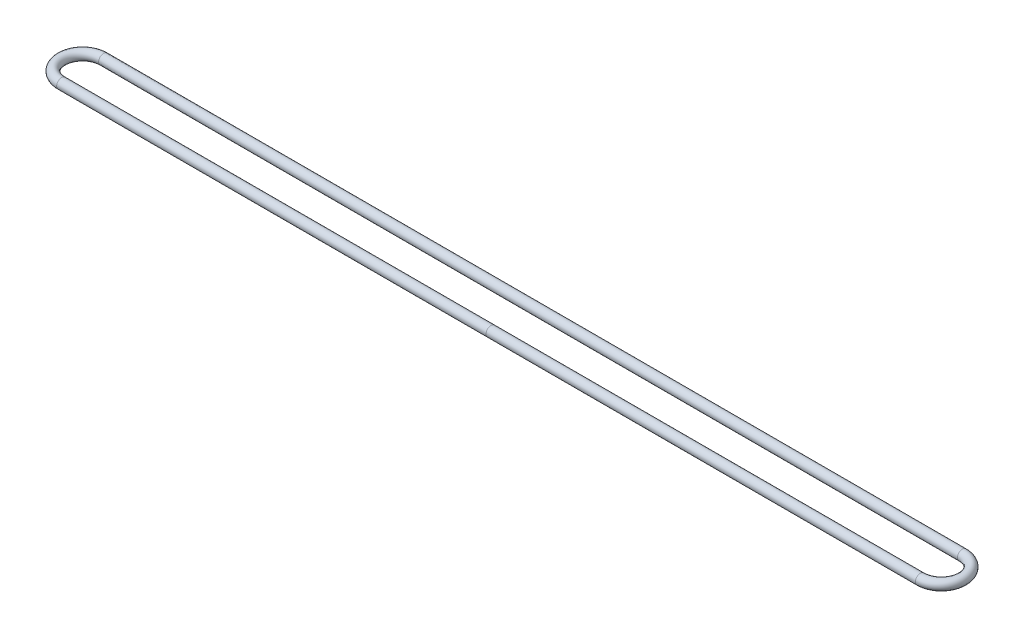
ISO-10303-21;
HEADER;
FILE_DESCRIPTION(('STEP AP214'),'2;1');
FILE_NAME('part.step','',(''),(''),'','','');
FILE_SCHEMA(('AUTOMOTIVE_DESIGN { 1 0 10303 214 1 1 1 1 }'));
ENDSEC;
DATA;
#1=APPLICATION_CONTEXT('core data for automotive mechanical design processes');
#2=APPLICATION_PROTOCOL_DEFINITION('international standard','automotive_design',2000,#1);
#3=PRODUCT_CONTEXT('',#1,'mechanical');
#4=PRODUCT('Part','Part','',(#3));
#5=PRODUCT_RELATED_PRODUCT_CATEGORY('part','',(#4));
#6=PRODUCT_DEFINITION_FORMATION('','',#4);
#7=PRODUCT_DEFINITION_CONTEXT('part definition',#1,'design');
#8=PRODUCT_DEFINITION('design','',#6,#7);
#9=PRODUCT_DEFINITION_SHAPE('','',#8);
#10=(LENGTH_UNIT() NAMED_UNIT(*) SI_UNIT(.MILLI.,.METRE.));
#11=(NAMED_UNIT(*) PLANE_ANGLE_UNIT() SI_UNIT($,.RADIAN.));
#12=(NAMED_UNIT(*) SI_UNIT($,.STERADIAN.) SOLID_ANGLE_UNIT());
#13=UNCERTAINTY_MEASURE_WITH_UNIT(LENGTH_MEASURE(1.E-05),#10,'distance_accuracy_value','');
#14=(GEOMETRIC_REPRESENTATION_CONTEXT(3) GLOBAL_UNCERTAINTY_ASSIGNED_CONTEXT((#13)) GLOBAL_UNIT_ASSIGNED_CONTEXT((#10,
#11,#12)) REPRESENTATION_CONTEXT('',''));
#15=CARTESIAN_POINT('',(0.,0.,0.));
#16=DIRECTION('',(0.,0.,1.));
#17=DIRECTION('',(1.,0.,0.));
#18=AXIS2_PLACEMENT_3D('',#15,#16,#17);
#19=CARTESIAN_POINT('',(0.,0.,6.98499999999997));
#20=DIRECTION('',(-1.,0.,0.));
#21=DIRECTION('',(0.,0.,1.));
#22=AXIS2_PLACEMENT_3D('',#19,#20,#21);
#23=CYLINDRICAL_SURFACE('',#22,1.651);
#24=CARTESIAN_POINT('',(-142.875,0.,6.985));
#25=DIRECTION('',(1.,0.,0.));
#26=DIRECTION('',(0.,0.,-1.));
#27=AXIS2_PLACEMENT_3D('',#24,#25,#26);
#28=CIRCLE('',#27,1.651);
#29=CARTESIAN_POINT('',(-142.875,0.,8.63600000000001));
#30=VERTEX_POINT('',#29);
#31=EDGE_CURVE('E52',#30,#30,#28,.T.);
#32=ORIENTED_EDGE('',*,*,#31,.T.);
#33=EDGE_LOOP('',(#32));
#34=FACE_BOUND('',#33,.T.);
#35=CARTESIAN_POINT('',(0.,0.,6.98499999999997));
#36=DIRECTION('',(1.,0.,0.));
#37=DIRECTION('',(0.,0.,-1.));
#38=AXIS2_PLACEMENT_3D('',#35,#36,#37);
#39=CIRCLE('',#38,1.651);
#40=CARTESIAN_POINT('',(0.,0.,5.33399999999997));
#41=VERTEX_POINT('',#40);
#42=EDGE_CURVE('E57',#41,#41,#39,.T.);
#43=ORIENTED_EDGE('',*,*,#42,.F.);
#44=EDGE_LOOP('',(#43));
#45=FACE_BOUND('',#44,.T.);
#46=ADVANCED_FACE('F37',(#34,#45),#23,.T.);
#47=CARTESIAN_POINT('',(-142.875,0.,0.));
#48=DIRECTION('',(0.,-1.,0.));
#49=DIRECTION('',(0.,0.,-1.));
#50=AXIS2_PLACEMENT_3D('',#47,#48,#49);
#51=TOROIDAL_SURFACE('',#50,6.985,1.651);
#52=CARTESIAN_POINT('',(-142.875,0.,-6.98499999999999));
#53=DIRECTION('',(-1.,0.,0.));
#54=DIRECTION('',(0.,0.,1.));
#55=AXIS2_PLACEMENT_3D('',#52,#53,#54);
#56=CIRCLE('',#55,1.651);
#57=CARTESIAN_POINT('',(-142.875,0.,-8.63599999999999));
#58=VERTEX_POINT('',#57);
#59=EDGE_CURVE('E48',#58,#58,#56,.T.);
#60=CARTESIAN_POINT('',(-142.875,0.,0.));
#61=DIRECTION('',(0.,-1.,0.));
#62=DIRECTION('',(0.,0.,-1.));
#63=AXIS2_PLACEMENT_3D('',#60,#61,#62);
#64=CIRCLE('',#63,8.636);
#65=EDGE_CURVE('',#30,#58,#64,.T.);
#66=ORIENTED_EDGE('',*,*,#31,.F.);
#67=ORIENTED_EDGE('',*,*,#59,.T.);
#68=ORIENTED_EDGE('',*,*,#65,.T.);
#69=ORIENTED_EDGE('',*,*,#65,.F.);
#70=EDGE_LOOP('',(#66,#68,#67,#69));
#71=FACE_BOUND('',#70,.T.);
#72=ADVANCED_FACE('F65',(#71),#51,.T.);
#73=CARTESIAN_POINT('',(-142.875,0.,-6.985));
#74=DIRECTION('',(1.,0.,0.));
#75=DIRECTION('',(0.,0.,-1.));
#76=AXIS2_PLACEMENT_3D('',#73,#74,#75);
#77=CYLINDRICAL_SURFACE('',#76,1.651);
#78=CARTESIAN_POINT('',(142.875,0.,-6.98500000000005));
#79=DIRECTION('',(-1.,0.,0.));
#80=DIRECTION('',(0.,0.,1.));
#81=AXIS2_PLACEMENT_3D('',#78,#79,#80);
#82=CIRCLE('',#81,1.651);
#83=CARTESIAN_POINT('',(142.875,0.,-8.63599999999999));
#84=VERTEX_POINT('',#83);
#85=EDGE_CURVE('E44',#84,#84,#82,.T.);
#86=ORIENTED_EDGE('',*,*,#85,.T.);
#87=EDGE_LOOP('',(#86));
#88=FACE_BOUND('',#87,.T.);
#89=ORIENTED_EDGE('',*,*,#59,.F.);
#90=EDGE_LOOP('',(#89));
#91=FACE_BOUND('',#90,.T.);
#92=ADVANCED_FACE('F71',(#88,#91),#77,.T.);
#93=CARTESIAN_POINT('',(142.875,0.,0.));
#94=DIRECTION('',(0.,-1.,0.));
#95=DIRECTION('',(0.,0.,-1.));
#96=AXIS2_PLACEMENT_3D('',#93,#94,#95);
#97=TOROIDAL_SURFACE('',#96,6.985,1.651);
#98=CARTESIAN_POINT('',(142.875,0.,6.98500000000001));
#99=DIRECTION('',(1.,0.,0.));
#100=DIRECTION('',(0.,0.,-1.));
#101=AXIS2_PLACEMENT_3D('',#98,#99,#100);
#102=CIRCLE('',#101,1.651);
#103=CARTESIAN_POINT('',(142.875,0.,8.63600000000001));
#104=VERTEX_POINT('',#103);
#105=EDGE_CURVE('E10',#104,#104,#102,.T.);
#106=CARTESIAN_POINT('',(142.875,0.,0.));
#107=DIRECTION('',(0.,-1.,0.));
#108=DIRECTION('',(0.,0.,-1.));
#109=AXIS2_PLACEMENT_3D('',#106,#107,#108);
#110=CIRCLE('',#109,8.636);
#111=EDGE_CURVE('',#84,#104,#110,.T.);
#112=ORIENTED_EDGE('',*,*,#85,.F.);
#113=ORIENTED_EDGE('',*,*,#105,.T.);
#114=ORIENTED_EDGE('',*,*,#111,.T.);
#115=ORIENTED_EDGE('',*,*,#111,.F.);
#116=EDGE_LOOP('',(#112,#114,#113,#115));
#117=FACE_BOUND('',#116,.T.);
#118=ADVANCED_FACE('F76',(#117),#97,.T.);
#119=CARTESIAN_POINT('',(142.875,0.,6.98499999999995));
#120=DIRECTION('',(-1.,0.,0.));
#121=DIRECTION('',(0.,0.,1.));
#122=AXIS2_PLACEMENT_3D('',#119,#120,#121);
#123=CYLINDRICAL_SURFACE('',#122,1.651);
#124=ORIENTED_EDGE('',*,*,#42,.T.);
#125=EDGE_LOOP('',(#124));
#126=FACE_BOUND('',#125,.T.);
#127=ORIENTED_EDGE('',*,*,#105,.F.);
#128=EDGE_LOOP('',(#127));
#129=FACE_BOUND('',#128,.T.);
#130=ADVANCED_FACE('F39',(#126,#129),#123,.T.);
#131=CLOSED_SHELL('',(#46,#72,#92,#118,#130));
#132=MANIFOLD_SOLID_BREP('B2',#131);
#133=ADVANCED_BREP_SHAPE_REPRESENTATION('',(#18,#132),#14);
#134=SHAPE_DEFINITION_REPRESENTATION(#9,#133);
ENDSEC;
END-ISO-10303-21;
